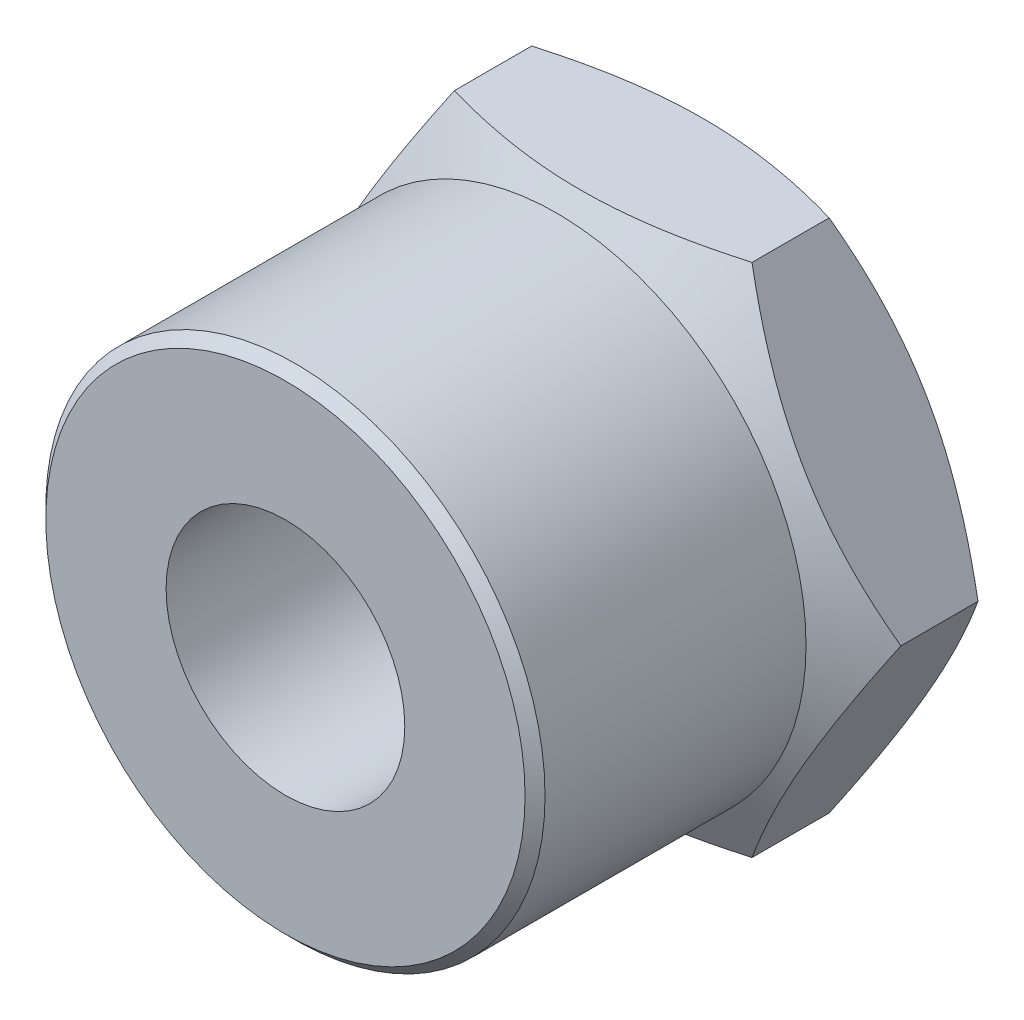
ISO-10303-21;
HEADER;
FILE_DESCRIPTION(('STEP AP214'),'2;1');
FILE_NAME('part.step','',(''),(''),'','','');
FILE_SCHEMA(('AUTOMOTIVE_DESIGN { 1 0 10303 214 1 1 1 1 }'));
ENDSEC;
DATA;
#1=APPLICATION_CONTEXT('core data for automotive mechanical design processes');
#2=APPLICATION_PROTOCOL_DEFINITION('international standard','automotive_design',2000,#1);
#3=PRODUCT_CONTEXT('',#1,'mechanical');
#4=PRODUCT('Part','Part','',(#3));
#5=PRODUCT_RELATED_PRODUCT_CATEGORY('part','',(#4));
#6=PRODUCT_DEFINITION_FORMATION('','',#4);
#7=PRODUCT_DEFINITION_CONTEXT('part definition',#1,'design');
#8=PRODUCT_DEFINITION('design','',#6,#7);
#9=PRODUCT_DEFINITION_SHAPE('','',#8);
#10=(LENGTH_UNIT() NAMED_UNIT(*) SI_UNIT(.MILLI.,.METRE.));
#11=(NAMED_UNIT(*) PLANE_ANGLE_UNIT() SI_UNIT($,.RADIAN.));
#12=(NAMED_UNIT(*) SI_UNIT($,.STERADIAN.) SOLID_ANGLE_UNIT());
#13=UNCERTAINTY_MEASURE_WITH_UNIT(LENGTH_MEASURE(1.E-05),#10,'distance_accuracy_value','');
#14=(GEOMETRIC_REPRESENTATION_CONTEXT(3) GLOBAL_UNCERTAINTY_ASSIGNED_CONTEXT((#13)) GLOBAL_UNIT_ASSIGNED_CONTEXT((#10,
#11,#12)) REPRESENTATION_CONTEXT('',''));
#15=CARTESIAN_POINT('',(0.,0.,0.));
#16=DIRECTION('',(0.,0.,1.));
#17=DIRECTION('',(1.,0.,0.));
#18=AXIS2_PLACEMENT_3D('',#15,#16,#17);
#19=CARTESIAN_POINT('',(2.02072594216369,-3.5,-2.32));
#20=DIRECTION('',(0.,0.,1.));
#21=DIRECTION('',(1.,0.,0.));
#22=AXIS2_PLACEMENT_3D('',#19,#20,#21);
#23=PLANE('',#22);
#24=CARTESIAN_POINT('',(0.,0.,-2.32));
#25=DIRECTION('',(0.,0.,-1.));
#26=DIRECTION('',(-1.,0.,0.));
#27=AXIS2_PLACEMENT_3D('',#24,#25,#26);
#28=CIRCLE('',#27,2.94);
#29=CARTESIAN_POINT('',(-2.94,0.,-2.32));
#30=VERTEX_POINT('',#29);
#31=EDGE_CURVE('E263',#30,#30,#28,.T.);
#32=ORIENTED_EDGE('',*,*,#31,.T.);
#33=EDGE_LOOP('',(#32));
#34=FACE_BOUND('',#33,.T.);
#35=CARTESIAN_POINT('',(0.,0.,-2.32));
#36=DIRECTION('',(0.,0.,-1.));
#37=DIRECTION('',(-1.,0.,0.));
#38=AXIS2_PLACEMENT_3D('',#35,#36,#37);
#39=CIRCLE('',#38,2.3);
#40=CARTESIAN_POINT('',(-2.3,0.,-2.32));
#41=VERTEX_POINT('',#40);
#42=EDGE_CURVE('E276',#41,#41,#39,.T.);
#43=ORIENTED_EDGE('',*,*,#42,.F.);
#44=EDGE_LOOP('',(#43));
#45=FACE_BOUND('',#44,.T.);
#46=ADVANCED_FACE('F40',(#34,#45),#23,.F.);
#47=CARTESIAN_POINT('',(0.,0.,-2.32));
#48=DIRECTION('',(0.,0.,1.));
#49=DIRECTION('',(1.,0.,0.));
#50=AXIS2_PLACEMENT_3D('',#47,#48,#49);
#51=CYLINDRICAL_SURFACE('',#50,1.621);
#52=CARTESIAN_POINT('',(0.,0.,3.68));
#53=DIRECTION('',(0.,0.,1.));
#54=DIRECTION('',(1.,0.,0.));
#55=AXIS2_PLACEMENT_3D('',#52,#53,#54);
#56=CIRCLE('',#55,1.621);
#57=CARTESIAN_POINT('',(1.621,0.,3.68));
#58=VERTEX_POINT('',#57);
#59=EDGE_CURVE('E272',#58,#58,#56,.T.);
#60=ORIENTED_EDGE('',*,*,#59,.T.);
#61=EDGE_LOOP('',(#60));
#62=FACE_BOUND('',#61,.T.);
#63=CARTESIAN_POINT('',(0.,0.,-1.64100000000001));
#64=DIRECTION('',(0.,0.,-1.));
#65=DIRECTION('',(-1.,0.,0.));
#66=AXIS2_PLACEMENT_3D('',#63,#64,#65);
#67=CIRCLE('',#66,1.621);
#68=CARTESIAN_POINT('',(-1.621,0.,-1.64100000000001));
#69=VERTEX_POINT('',#68);
#70=EDGE_CURVE('E280',#69,#69,#67,.T.);
#71=ORIENTED_EDGE('',*,*,#70,.T.);
#72=EDGE_LOOP('',(#71));
#73=FACE_BOUND('',#72,.T.);
#74=ADVANCED_FACE('F145',(#62,#73),#51,.F.);
#75=CARTESIAN_POINT('',(-2.02072594216369,-3.5,-2.32));
#76=DIRECTION('',(0.,-1.,0.));
#77=DIRECTION('',(1.,0.,0.));
#78=AXIS2_PLACEMENT_3D('',#75,#76,#77);
#79=PLANE('',#78);
#80=DIRECTION('',(0.,0.,1.));
#81=VECTOR('',#80,1.);
#82=CARTESIAN_POINT('',(2.02072594216369,-3.5,-2.32));
#83=LINE('',#82,#81);
#84=CARTESIAN_POINT('',(2.02072594216369,-3.5,-1.68407645808418));
#85=VERTEX_POINT('',#84);
#86=CARTESIAN_POINT('',(2.02072594216369,-3.5,-0.635923541915821));
#87=VERTEX_POINT('',#86);
#88=EDGE_CURVE('E126',#85,#87,#83,.T.);
#89=ORIENTED_EDGE('',*,*,#88,.T.);
#90=CARTESIAN_POINT('',(-5.31454874845532,-3.5,-1.9765720811429));
#91=CARTESIAN_POINT('',(-5.16258122990756,-3.5,-1.90331759820139));
#92=CARTESIAN_POINT('',(-5.01025238241219,-3.5,-1.83079919452992));
#93=CARTESIAN_POINT('',(-4.70467938387715,-3.5,-1.68765105137344));
#94=CARTESIAN_POINT('',(-4.55143508199682,-3.5,-1.61702163426252));
#95=CARTESIAN_POINT('',(-4.24299316158612,-3.5,-1.47768799287055));
#96=CARTESIAN_POINT('',(-4.08778936349747,-3.5,-1.40899739849654));
#97=CARTESIAN_POINT('',(-3.77610673866024,-3.5,-1.27458362807589));
#98=CARTESIAN_POINT('',(-3.61962797622453,-3.5,-1.20886030343221));
#99=CARTESIAN_POINT('',(-3.3005804505127,-3.5,-1.07931444616043));
#100=CARTESIAN_POINT('',(-3.13796663574968,-3.5,-1.01560223304694));
#101=CARTESIAN_POINT('',(-2.81079517715601,-3.5,-0.893280259239621));
#102=CARTESIAN_POINT('',(-2.64623731184219,-3.5,-0.834671086421076));
#103=CARTESIAN_POINT('',(-2.31526247835521,-3.5,-0.724177334443883));
#104=CARTESIAN_POINT('',(-2.14885045472674,-3.5,-0.672278099740526));
#105=CARTESIAN_POINT('',(-1.81364346014062,-3.5,-0.576943589600243));
#106=CARTESIAN_POINT('',(-1.64484929409527,-3.5,-0.533505525297072));
#107=CARTESIAN_POINT('',(-1.30568260005149,-3.5,-0.45747156967565));
#108=CARTESIAN_POINT('',(-1.13532228771221,-3.5,-0.424822222659642));
#109=CARTESIAN_POINT('',(-0.792607865436793,-3.5,-0.372291505668301));
#110=CARTESIAN_POINT('',(-0.620253909975512,-3.5,-0.352409153116377));
#111=CARTESIAN_POINT('',(-0.276613915604334,-3.5,-0.327259641551));
#112=CARTESIAN_POINT('',(-0.105341294584288,-3.5,-0.321813613265414));
#113=CARTESIAN_POINT('',(0.237055776931101,-3.5,-0.325534073470602));
#114=CARTESIAN_POINT('',(0.408180221365878,-3.5,-0.334701133794465));
#115=CARTESIAN_POINT('',(0.702169689121267,-3.5,-0.36237316965813));
#116=CARTESIAN_POINT('',(0.825358031993441,-3.5,-0.377614848627587));
#117=CARTESIAN_POINT('',(1.07075148822538,-3.5,-0.414658088633187));
#118=CARTESIAN_POINT('',(1.19295645014118,-3.5,-0.43646064093995));
#119=CARTESIAN_POINT('',(1.55797864523314,-3.5,-0.510554721049551));
#120=CARTESIAN_POINT('',(1.79905117963938,-3.5,-0.571516553748571));
#121=CARTESIAN_POINT('',(2.15941640181095,-3.5,-0.676194944406321));
#122=CARTESIAN_POINT('',(2.28060052215148,-3.5,-0.713762203690888));
#123=CARTESIAN_POINT('',(2.52179042226329,-3.5,-0.792539132299104));
#124=CARTESIAN_POINT('',(2.64179619441257,-3.5,-0.833748825166124));
#125=CARTESIAN_POINT('',(2.88067287145959,-3.5,-0.919171049808449));
#126=CARTESIAN_POINT('',(2.9995441911813,-3.5,-0.963382431928097));
#127=CARTESIAN_POINT('',(3.23631937174955,-3.5,-1.0543141707443));
#128=CARTESIAN_POINT('',(3.35422324182582,-3.5,-1.10103450347266));
#129=CARTESIAN_POINT('',(3.62325055264463,-3.5,-1.21041576615162));
#130=CARTESIAN_POINT('',(3.77409149467181,-3.5,-1.27377014376321));
#131=CARTESIAN_POINT('',(4.07458232381806,-3.5,-1.40324911382263));
#132=CARTESIAN_POINT('',(4.22423215400073,-3.5,-1.46937383776075));
#133=CARTESIAN_POINT('',(4.67173417074864,-3.5,-1.67107785140336));
#134=CARTESIAN_POINT('',(4.96809261237308,-3.5,-1.80996775263601));
#135=CARTESIAN_POINT('',(5.55823741540797,-3.5,-2.09369707696542));
#136=CARTESIAN_POINT('',(5.85202130868344,-3.5,-2.23854158231514));
#137=CARTESIAN_POINT('',(6.43755760037217,-3.5,-2.53229352913512));
#138=CARTESIAN_POINT('',(6.72930993368927,-3.5,-2.68120110005087));
#139=CARTESIAN_POINT('',(7.28854142597025,-3.5,-2.97015797177944));
#140=CARTESIAN_POINT('',(7.55613381304253,-3.5,-3.10998884424144));
#141=CARTESIAN_POINT('',(8.09034031227495,-3.5,-3.39152342794629));
#142=CARTESIAN_POINT('',(8.35695439615905,-3.5,-3.53322719278529));
#143=CARTESIAN_POINT('',(8.88884338623101,-3.5,-3.81776700197264));
#144=CARTESIAN_POINT('',(9.15411993703118,-3.5,-3.9605999764179));
#145=CARTESIAN_POINT('',(9.68404251934625,-3.5,-4.24740142981055));
#146=CARTESIAN_POINT('',(9.94868858014317,-3.5,-4.39136985463041));
#147=CARTESIAN_POINT('',(10.2130999375188,-3.5,-4.53576517093096));
#148=B_SPLINE_CURVE_WITH_KNOTS('',3,(#90,#91,#92,#93,#94,#95,#96,#97,#98,#99,#100,#101,#102,
#103,#104,#105,#106,#107,#108,#109,#110,#111,#112,#113,#114,#115,#116,#117,#118,#119,#120,#121,
#122,#123,#124,#125,#126,#127,#128,#129,#130,#131,#132,#133,#134,#135,#136,#137,#138,#139,#140,
#141,#142,#143,#144,#145,#146,#147),.UNSPECIFIED.,.F.,.F.,(4,2,2,2,2,2,2,2,2,2,2,2,2,2,2,2,2,2,
2,2,2,2,2,2,2,2,2,2,4),(0.,0.506112602260914,1.01231103347324,1.52146159900116,2.03058663857857,
2.55446946144371,3.07841255649538,3.60119121754863,4.12379727410696,4.64377368851295,
5.16371007956734,5.67717355982242,6.19065713320245,6.56285735176149,6.93511383364488,
7.68008332937184,8.06067514319643,8.44126941720855,8.82171873597982,9.20216442093658,
9.69294431735731,10.1837475343527,11.165504223446,12.1481169836564,13.1307610856319,
14.0365256940763,14.9423162789471,15.8461695773097,16.7499800458511),.UNSPECIFIED.);
#149=CARTESIAN_POINT('',(-2.02072594216369,-3.5,-0.635923541915821));
#150=VERTEX_POINT('',#149);
#151=EDGE_CURVE('E55',#87,#150,#148,.F.);
#152=ORIENTED_EDGE('',*,*,#151,.T.);
#153=DIRECTION('',(0.,0.,1.));
#154=VECTOR('',#153,1.);
#155=CARTESIAN_POINT('',(-2.02072594216369,-3.5,-2.32));
#156=LINE('',#155,#154);
#157=CARTESIAN_POINT('',(-2.02072594216369,-3.5,-1.68407645808418));
#158=VERTEX_POINT('',#157);
#159=EDGE_CURVE('E109',#158,#150,#156,.T.);
#160=ORIENTED_EDGE('',*,*,#159,.F.);
#161=CARTESIAN_POINT('',(-5.31454874845532,-3.5,-0.343427918857098));
#162=CARTESIAN_POINT('',(-5.16258122990756,-3.5,-0.416682401798613));
#163=CARTESIAN_POINT('',(-5.01025238241219,-3.5,-0.489200805470075));
#164=CARTESIAN_POINT('',(-4.70467938387715,-3.5,-0.632348948626556));
#165=CARTESIAN_POINT('',(-4.55143508199682,-3.5,-0.70297836573748));
#166=CARTESIAN_POINT('',(-4.24299316158612,-3.5,-0.842312007129446));
#167=CARTESIAN_POINT('',(-4.08778936349747,-3.5,-0.911002601503458));
#168=CARTESIAN_POINT('',(-3.77610673866024,-3.5,-1.04541637192411));
#169=CARTESIAN_POINT('',(-3.61962797622453,-3.5,-1.11113969656779));
#170=CARTESIAN_POINT('',(-3.3005804505127,-3.5,-1.24068555383956));
#171=CARTESIAN_POINT('',(-3.13796663574968,-3.5,-1.30439776695306));
#172=CARTESIAN_POINT('',(-2.81079517715601,-3.5,-1.42671974076038));
#173=CARTESIAN_POINT('',(-2.64623731184219,-3.5,-1.48532891357892));
#174=CARTESIAN_POINT('',(-2.31526247835521,-3.5,-1.59582266555612));
#175=CARTESIAN_POINT('',(-2.14885045472674,-3.5,-1.64772190025947));
#176=CARTESIAN_POINT('',(-1.81364346014062,-3.5,-1.74305641039976));
#177=CARTESIAN_POINT('',(-1.64484929409527,-3.5,-1.78649447470293));
#178=CARTESIAN_POINT('',(-1.30568260005149,-3.5,-1.86252843032435));
#179=CARTESIAN_POINT('',(-1.13532228771221,-3.5,-1.89517777734036));
#180=CARTESIAN_POINT('',(-0.792607865436793,-3.5,-1.9477084943317));
#181=CARTESIAN_POINT('',(-0.620253909975512,-3.5,-1.96759084688362));
#182=CARTESIAN_POINT('',(-0.276613915604334,-3.5,-1.992740358449));
#183=CARTESIAN_POINT('',(-0.105341294584288,-3.5,-1.99818638673459));
#184=CARTESIAN_POINT('',(0.237055776931101,-3.5,-1.9944659265294));
#185=CARTESIAN_POINT('',(0.408180221365878,-3.5,-1.98529886620553));
#186=CARTESIAN_POINT('',(0.702169689121266,-3.5,-1.95762683034187));
#187=CARTESIAN_POINT('',(0.82535803199344,-3.5,-1.94238515137241));
#188=CARTESIAN_POINT('',(1.07075148822538,-3.5,-1.90534191136681));
#189=CARTESIAN_POINT('',(1.19295645014118,-3.5,-1.88353935906005));
#190=CARTESIAN_POINT('',(1.55797864523314,-3.5,-1.80944527895045));
#191=CARTESIAN_POINT('',(1.79905117963938,-3.5,-1.74848344625143));
#192=CARTESIAN_POINT('',(2.15941640181095,-3.5,-1.64380505559368));
#193=CARTESIAN_POINT('',(2.28060052215148,-3.5,-1.60623779630911));
#194=CARTESIAN_POINT('',(2.52179042226329,-3.5,-1.5274608677009));
#195=CARTESIAN_POINT('',(2.64179619441257,-3.5,-1.48625117483388));
#196=CARTESIAN_POINT('',(2.88067287145959,-3.5,-1.40082895019155));
#197=CARTESIAN_POINT('',(2.9995441911813,-3.5,-1.3566175680719));
#198=CARTESIAN_POINT('',(3.23631937174955,-3.5,-1.2656858292557));
#199=CARTESIAN_POINT('',(3.35422324182582,-3.5,-1.21896549652734));
#200=CARTESIAN_POINT('',(3.62325055264463,-3.5,-1.10958423384838));
#201=CARTESIAN_POINT('',(3.77409149467181,-3.5,-1.04622985623679));
#202=CARTESIAN_POINT('',(4.07458232381806,-3.5,-0.916750886177373));
#203=CARTESIAN_POINT('',(4.22423215400073,-3.5,-0.850626162239254));
#204=CARTESIAN_POINT('',(4.67173417074864,-3.5,-0.648922148596642));
#205=CARTESIAN_POINT('',(4.96809261237308,-3.5,-0.510032247363986));
#206=CARTESIAN_POINT('',(5.55823741540797,-3.5,-0.226302923034582));
#207=CARTESIAN_POINT('',(5.85202130868344,-3.5,-0.081458417684857));
#208=CARTESIAN_POINT('',(6.43755760037218,-3.5,0.212293529135127));
#209=CARTESIAN_POINT('',(6.72930993368927,-3.5,0.361201100050876));
#210=CARTESIAN_POINT('',(7.28854142597026,-3.5,0.650157971779439));
#211=CARTESIAN_POINT('',(7.55613381304253,-3.5,0.789988844241439));
#212=CARTESIAN_POINT('',(8.09034031227495,-3.5,1.07152342794629));
#213=CARTESIAN_POINT('',(8.35695439615905,-3.5,1.21322719278529));
#214=CARTESIAN_POINT('',(8.88884338623101,-3.5,1.49776700197264));
#215=CARTESIAN_POINT('',(9.15411993703118,-3.5,1.6405999764179));
#216=CARTESIAN_POINT('',(9.68404251934625,-3.5,1.92740142981055));
#217=CARTESIAN_POINT('',(9.94868858014317,-3.5,2.07136985463041));
#218=CARTESIAN_POINT('',(10.2130999375188,-3.5,2.21576517093097));
#219=B_SPLINE_CURVE_WITH_KNOTS('',3,(#161,#162,#163,#164,#165,#166,#167,#168,#169,#170,#171,
#172,#173,#174,#175,#176,#177,#178,#179,#180,#181,#182,#183,#184,#185,#186,#187,#188,#189,#190,
#191,#192,#193,#194,#195,#196,#197,#198,#199,#200,#201,#202,#203,#204,#205,#206,#207,#208,#209,
#210,#211,#212,#213,#214,#215,#216,#217,#218),.UNSPECIFIED.,.F.,.F.,(4,2,2,2,2,2,2,2,2,2,2,2,2,
2,2,2,2,2,2,2,2,2,2,2,2,2,2,2,4),(0.,0.506112602260913,1.01231103347324,1.52146159900116,
2.03058663857857,2.55446946144371,3.07841255649537,3.60119121754863,4.12379727410696,
4.64377368851295,5.16371007956734,5.67717355982242,6.19065713320245,6.56285735176149,
6.93511383364488,7.68008332937184,8.06067514319643,8.44126941720855,8.82171873597982,
9.20216442093658,9.69294431735731,10.1837475343527,11.165504223446,12.1481169836564,
13.1307610856319,14.0365256940763,14.9423162789471,15.8461695773097,16.7499800458511),.UNSPECIFIED.);
#220=EDGE_CURVE('E128',#158,#85,#219,.T.);
#221=ORIENTED_EDGE('',*,*,#220,.T.);
#222=EDGE_LOOP('',(#89,#152,#160,#221));
#223=FACE_BOUND('',#222,.T.);
#224=ADVANCED_FACE('F151',(#223),#79,.T.);
#225=CARTESIAN_POINT('',(-4.04145188432738,0.,-2.32));
#226=DIRECTION('',(-0.866025403784438,-0.5,0.));
#227=DIRECTION('',(0.5,-0.866025403784439,0.));
#228=AXIS2_PLACEMENT_3D('',#225,#226,#227);
#229=PLANE('',#228);
#230=ORIENTED_EDGE('',*,*,#159,.T.);
#231=CARTESIAN_POINT('',(-2.02061047210985,-3.5002,-0.635990211439551));
#232=CARTESIAN_POINT('',(-2.10941108799267,-3.34639282154755,-0.584701939736164));
#233=CARTESIAN_POINT('',(-2.19897822522909,-3.19125798916558,-0.538057104562379));
#234=CARTESIAN_POINT('',(-2.37966345361545,-2.87830199342322,-0.456638026279531));
#235=CARTESIAN_POINT('',(-2.47078475532382,-2.7204752692125,-0.421892586330745));
#236=CARTESIAN_POINT('',(-2.65189807961074,-2.40677778961987,-0.36780617792902));
#237=CARTESIAN_POINT('',(-2.74186223545399,-2.25095530083931,-0.348105237006566));
#238=CARTESIAN_POINT('',(-2.92221386641056,-1.93857711279463,-0.324586283483439));
#239=CARTESIAN_POINT('',(-3.01260068598001,-1.78202254896577,-0.32074879529175));
#240=CARTESIAN_POINT('',(-3.1814939814933,-1.48949078007901,-0.328731452623163));
#241=CARTESIAN_POINT('',(-3.26002573814993,-1.3534697875421,-0.338591584815792));
#242=CARTESIAN_POINT('',(-3.41657761679354,-1.08231397971101,-0.369842617645588));
#243=CARTESIAN_POINT('',(-3.49459719728458,-0.947180102315318,-0.391244194031982));
#244=CARTESIAN_POINT('',(-3.65147186489429,-0.675465207594817,-0.444746558626761));
#245=CARTESIAN_POINT('',(-3.73030709667644,-0.538918580721665,-0.47707414519127));
#246=CARTESIAN_POINT('',(-3.88680174018324,-0.267861907055498,-0.550445084554177));
#247=CARTESIAN_POINT('',(-3.96446315689009,-0.133348387531463,-0.591471197316049));
#248=CARTESIAN_POINT('',(-4.04156735438122,0.000200000000000535,-0.635990211439552));
#249=B_SPLINE_CURVE_WITH_KNOTS('',3,(#231,#232,#233,#234,#235,#236,#237,#238,#239,#240,#241,
#242,#243,#244,#245,#246,#247,#248),.UNSPECIFIED.,.F.,.F.,(4,2,2,2,2,2,2,2,4),(0.,
0.554793832886252,1.11092123814983,1.65328467083218,2.19498204478403,2.6666513085086,
3.13875761298267,3.62133612600509,4.10296698719187),.UNSPECIFIED.);
#250=CARTESIAN_POINT('',(-4.04145188432738,0.,-0.635923541915821));
#251=VERTEX_POINT('',#250);
#252=EDGE_CURVE('E94',#150,#251,#249,.T.);
#253=ORIENTED_EDGE('',*,*,#252,.T.);
#254=DIRECTION('',(0.,0.,1.));
#255=VECTOR('',#254,1.);
#256=CARTESIAN_POINT('',(-4.04145188432738,0.,-2.32));
#257=LINE('',#256,#255);
#258=CARTESIAN_POINT('',(-4.04145188432738,0.,-1.68407645808418));
#259=VERTEX_POINT('',#258);
#260=EDGE_CURVE('E107',#259,#251,#257,.T.);
#261=ORIENTED_EDGE('',*,*,#260,.F.);
#262=CARTESIAN_POINT('',(-4.04156735438122,0.000200000000000461,-1.68400978856045));
#263=CARTESIAN_POINT('',(-3.9527667384984,-0.153607178452449,-1.73529806026383));
#264=CARTESIAN_POINT('',(-3.86319960126198,-0.308742010834423,-1.78194289543762));
#265=CARTESIAN_POINT('',(-3.68251437287563,-0.62169800657678,-1.86336197372047));
#266=CARTESIAN_POINT('',(-3.59139307116725,-0.779524730787495,-1.89810741366925));
#267=CARTESIAN_POINT('',(-3.41027974688034,-1.09322221038013,-1.95219382207098));
#268=CARTESIAN_POINT('',(-3.32031559103708,-1.24904469916069,-1.97189476299343));
#269=CARTESIAN_POINT('',(-3.13996396008052,-1.56142288720537,-1.99541371651656));
#270=CARTESIAN_POINT('',(-3.04957714051106,-1.71797745103423,-1.99925120470825));
#271=CARTESIAN_POINT('',(-2.88068384499778,-2.01050921992099,-1.99126854737684));
#272=CARTESIAN_POINT('',(-2.80215208834115,-2.1465302124579,-1.98140841518421));
#273=CARTESIAN_POINT('',(-2.64560020969754,-2.41768602028899,-1.95015738235441));
#274=CARTESIAN_POINT('',(-2.5675806292065,-2.55281989768468,-1.92875580596802));
#275=CARTESIAN_POINT('',(-2.41070596159679,-2.82453479240518,-1.87525344137324));
#276=CARTESIAN_POINT('',(-2.33187072981464,-2.96108141927833,-1.84292585480873));
#277=CARTESIAN_POINT('',(-2.17537608630783,-3.2321380929445,-1.76955491544582));
#278=CARTESIAN_POINT('',(-2.09771466960099,-3.36665161246854,-1.72852880268395));
#279=CARTESIAN_POINT('',(-2.02061047210985,-3.5002,-1.68400978856045));
#280=B_SPLINE_CURVE_WITH_KNOTS('',3,(#262,#263,#264,#265,#266,#267,#268,#269,#270,#271,#272,
#273,#274,#275,#276,#277,#278,#279),.UNSPECIFIED.,.F.,.F.,(4,2,2,2,2,2,2,2,4),(0.,
0.554793832886253,1.11092123814983,1.65328467083218,2.19498204478403,2.6666513085086,
3.13875761298267,3.62133612600509,4.10296698719187),.UNSPECIFIED.);
#281=EDGE_CURVE('E165',#259,#158,#280,.T.);
#282=ORIENTED_EDGE('',*,*,#281,.T.);
#283=EDGE_LOOP('',(#230,#253,#261,#282));
#284=FACE_BOUND('',#283,.T.);
#285=ADVANCED_FACE('F105',(#284),#229,.T.);
#286=CARTESIAN_POINT('',(-2.02072594216369,3.5,-2.32));
#287=DIRECTION('',(-0.866025403784439,0.5,0.));
#288=DIRECTION('',(-0.5,-0.866025403784439,0.));
#289=AXIS2_PLACEMENT_3D('',#286,#287,#288);
#290=PLANE('',#289);
#291=ORIENTED_EDGE('',*,*,#260,.T.);
#292=CARTESIAN_POINT('',(-4.04156735438122,-0.000199999999999577,-0.635990211439552));
#293=CARTESIAN_POINT('',(-3.9527667384984,0.15360717845245,-0.584701939736165));
#294=CARTESIAN_POINT('',(-3.86319960126198,0.308742010834424,-0.538057104562379));
#295=CARTESIAN_POINT('',(-3.68251437287562,0.621698006576781,-0.456638026279532));
#296=CARTESIAN_POINT('',(-3.59139307116725,0.779524730787495,-0.421892586330746));
#297=CARTESIAN_POINT('',(-3.41027974688034,1.09322221038013,-0.367806177929021));
#298=CARTESIAN_POINT('',(-3.32031559103708,1.24904469916069,-0.348105237006567));
#299=CARTESIAN_POINT('',(-3.13996396008052,1.56142288720537,-0.32458628348344));
#300=CARTESIAN_POINT('',(-3.04957714051106,1.71797745103423,-0.320748795291751));
#301=CARTESIAN_POINT('',(-2.88068384499778,2.01050921992099,-0.328731452623163));
#302=CARTESIAN_POINT('',(-2.80215208834115,2.1465302124579,-0.338591584815792));
#303=CARTESIAN_POINT('',(-2.64560020969754,2.41768602028899,-0.369842617645588));
#304=CARTESIAN_POINT('',(-2.5675806292065,2.55281989768468,-0.391244194031982));
#305=CARTESIAN_POINT('',(-2.41070596159679,2.82453479240518,-0.44474655862676));
#306=CARTESIAN_POINT('',(-2.33187072981464,2.96108141927834,-0.477074145191269));
#307=CARTESIAN_POINT('',(-2.17537608630783,3.2321380929445,-0.550445084554175));
#308=CARTESIAN_POINT('',(-2.09771466960099,3.36665161246854,-0.591471197316047));
#309=CARTESIAN_POINT('',(-2.02061047210985,3.5002,-0.635990211439551));
#310=B_SPLINE_CURVE_WITH_KNOTS('',3,(#292,#293,#294,#295,#296,#297,#298,#299,#300,#301,#302,
#303,#304,#305,#306,#307,#308,#309),.UNSPECIFIED.,.F.,.F.,(4,2,2,2,2,2,2,2,4),(0.,
0.554793832886253,1.11092123814983,1.65328467083218,2.19498204478403,2.6666513085086,
3.13875761298267,3.62133612600509,4.10296698719187),.UNSPECIFIED.);
#311=CARTESIAN_POINT('',(-2.02072594216369,3.5,-0.635923541915821));
#312=VERTEX_POINT('',#311);
#313=EDGE_CURVE('E91',#251,#312,#310,.T.);
#314=ORIENTED_EDGE('',*,*,#313,.T.);
#315=DIRECTION('',(0.,0.,1.));
#316=VECTOR('',#315,1.);
#317=CARTESIAN_POINT('',(-2.02072594216369,3.5,-2.32));
#318=LINE('',#317,#316);
#319=CARTESIAN_POINT('',(-2.02072594216368,3.5,-1.68407645808418));
#320=VERTEX_POINT('',#319);
#321=EDGE_CURVE('E114',#320,#312,#318,.T.);
#322=ORIENTED_EDGE('',*,*,#321,.F.);
#323=CARTESIAN_POINT('',(-2.02061047210985,3.5002,-1.68400978856045));
#324=CARTESIAN_POINT('',(-2.10941108799267,3.34639282154755,-1.73529806026383));
#325=CARTESIAN_POINT('',(-2.19897822522909,3.19125798916558,-1.78194289543762));
#326=CARTESIAN_POINT('',(-2.37966345361545,2.87830199342322,-1.86336197372047));
#327=CARTESIAN_POINT('',(-2.47078475532382,2.72047526921251,-1.89810741366925));
#328=CARTESIAN_POINT('',(-2.65189807961074,2.40677778961987,-1.95219382207098));
#329=CARTESIAN_POINT('',(-2.74186223545399,2.25095530083931,-1.97189476299343));
#330=CARTESIAN_POINT('',(-2.92221386641056,1.93857711279463,-1.99541371651656));
#331=CARTESIAN_POINT('',(-3.01260068598001,1.78202254896577,-1.99925120470825));
#332=CARTESIAN_POINT('',(-3.1814939814933,1.48949078007901,-1.99126854737684));
#333=CARTESIAN_POINT('',(-3.26002573814993,1.3534697875421,-1.98140841518421));
#334=CARTESIAN_POINT('',(-3.41657761679354,1.08231397971101,-1.95015738235441));
#335=CARTESIAN_POINT('',(-3.49459719728458,0.947180102315319,-1.92875580596802));
#336=CARTESIAN_POINT('',(-3.65147186489429,0.675465207594818,-1.87525344137324));
#337=CARTESIAN_POINT('',(-3.73030709667644,0.538918580721666,-1.84292585480873));
#338=CARTESIAN_POINT('',(-3.88680174018324,0.267861907055499,-1.76955491544582));
#339=CARTESIAN_POINT('',(-3.96446315689009,0.133348387531464,-1.72852880268395));
#340=CARTESIAN_POINT('',(-4.04156735438122,-0.00019999999999979,-1.68400978856045));
#341=B_SPLINE_CURVE_WITH_KNOTS('',3,(#323,#324,#325,#326,#327,#328,#329,#330,#331,#332,#333,
#334,#335,#336,#337,#338,#339,#340),.UNSPECIFIED.,.F.,.F.,(4,2,2,2,2,2,2,2,4),(0.,
0.554793832886252,1.11092123814983,1.65328467083218,2.19498204478403,2.6666513085086,
3.13875761298267,3.62133612600509,4.10296698719187),.UNSPECIFIED.);
#342=EDGE_CURVE('E113',#320,#259,#341,.T.);
#343=ORIENTED_EDGE('',*,*,#342,.T.);
#344=EDGE_LOOP('',(#291,#314,#322,#343));
#345=FACE_BOUND('',#344,.T.);
#346=ADVANCED_FACE('F112',(#345),#290,.T.);
#347=CARTESIAN_POINT('',(2.02072594216369,3.5,-2.32));
#348=DIRECTION('',(0.,1.,0.));
#349=DIRECTION('',(-1.,0.,0.));
#350=AXIS2_PLACEMENT_3D('',#347,#348,#349);
#351=PLANE('',#350);
#352=ORIENTED_EDGE('',*,*,#321,.T.);
#353=CARTESIAN_POINT('',(-5.31454874840541,3.5,-1.97657208111884));
#354=CARTESIAN_POINT('',(-5.16258122985933,3.5,-1.90331759817834));
#355=CARTESIAN_POINT('',(-5.01025238236563,3.5,-1.83079919450789));
#356=CARTESIAN_POINT('',(-4.70467938383394,3.5,-1.68765105135343));
#357=CARTESIAN_POINT('',(-4.55143508195529,3.5,-1.61702163424352));
#358=CARTESIAN_POINT('',(-4.24299316154799,3.5,-1.47768799285357));
#359=CARTESIAN_POINT('',(-4.08778936346104,3.5,-1.40899739848057));
#360=CARTESIAN_POINT('',(-3.77610673862723,3.5,-1.27458362806192));
#361=CARTESIAN_POINT('',(-3.61962797619325,3.5,-1.20886030341923));
#362=CARTESIAN_POINT('',(-3.30058045048498,3.5,-1.07931444614946));
#363=CARTESIAN_POINT('',(-3.13796663572379,3.5,-1.01560223303697));
#364=CARTESIAN_POINT('',(-2.81079517713381,3.5,-0.893280259231607));
#365=CARTESIAN_POINT('',(-2.64623731182185,3.5,-0.834671086414012));
#366=CARTESIAN_POINT('',(-2.31526247833863,3.5,-0.724177334438621));
#367=CARTESIAN_POINT('',(-2.14885045471206,3.5,-0.672278099736118));
#368=CARTESIAN_POINT('',(-1.81364346012979,3.5,-0.576943589597394));
#369=CARTESIAN_POINT('',(-1.64484929408638,3.5,-0.53350552529493));
#370=CARTESIAN_POINT('',(-1.30568260004756,3.5,-0.457471569674922));
#371=CARTESIAN_POINT('',(-1.13532228771131,3.5,-0.424822222659559));
#372=CARTESIAN_POINT('',(-0.792607865442006,3.5,-0.372291505669046));
#373=CARTESIAN_POINT('',(-0.620253909983814,3.5,-0.352409153117303));
#374=CARTESIAN_POINT('',(-0.27661391561876,3.5,-0.327259641551743));
#375=CARTESIAN_POINT('',(-0.105341294601749,3.5,-0.321813613265802));
#376=CARTESIAN_POINT('',(0.237055776907625,3.5,-0.32553407346977));
#377=CARTESIAN_POINT('',(0.408180221339422,3.5,-0.334701133792768));
#378=CARTESIAN_POINT('',(0.702169689090969,3.5,-0.362373169654703));
#379=CARTESIAN_POINT('',(0.825358031962249,3.5,-0.377614848623463));
#380=CARTESIAN_POINT('',(1.07075148819244,3.5,-0.414658088627631));
#381=CARTESIAN_POINT('',(1.19295645010738,3.5,-0.43646064093366));
#382=CARTESIAN_POINT('',(1.55797864519681,3.5,-0.510554721041038));
#383=CARTESIAN_POINT('',(1.79905117960143,3.5,-0.571516553738553));
#384=CARTESIAN_POINT('',(2.15941640177056,3.5,-0.676194944394077));
#385=CARTESIAN_POINT('',(2.28060052211027,3.5,-0.713762203677897));
#386=CARTESIAN_POINT('',(2.52179042222043,3.5,-0.792539132284638));
#387=CARTESIAN_POINT('',(2.64179619436889,3.5,-0.83374882515093));
#388=CARTESIAN_POINT('',(2.88067287141428,3.5,-0.919171049791824));
#389=CARTESIAN_POINT('',(2.99954419113518,3.5,-0.963382431910767));
#390=CARTESIAN_POINT('',(3.2363193717018,3.5,-1.05431417072558));
#391=CARTESIAN_POINT('',(3.35422324177726,3.5,-1.10103450345325));
#392=CARTESIAN_POINT('',(3.62325055259547,3.5,-1.21041576613119));
#393=CARTESIAN_POINT('',(3.77409149462286,3.5,-1.27377014374248));
#394=CARTESIAN_POINT('',(4.0745823237695,3.5,-1.40324911380135));
#395=CARTESIAN_POINT('',(4.22423215395235,3.5,-1.46937383773923));
#396=CARTESIAN_POINT('',(4.67173417070078,3.5,-1.67107785138121));
#397=CARTESIAN_POINT('',(4.96809261232553,3.5,-1.80996775261355));
#398=CARTESIAN_POINT('',(5.558237415361,3.5,-2.09369707694245));
#399=CARTESIAN_POINT('',(5.85202130863674,3.5,-2.23854158229198));
#400=CARTESIAN_POINT('',(6.43755760032597,3.5,-2.53229352911168));
#401=CARTESIAN_POINT('',(6.7293099336433,3.5,-2.68120110002732));
#402=CARTESIAN_POINT('',(7.28854142592454,3.5,-2.97015797175564));
#403=CARTESIAN_POINT('',(7.55613381299684,3.5,-3.1099888442175));
#404=CARTESIAN_POINT('',(8.09034031222931,3.5,-3.3915234279221));
#405=CARTESIAN_POINT('',(8.35695439611342,3.5,-3.53322719276098));
#406=CARTESIAN_POINT('',(8.88884338618538,3.5,-3.81776700194812));
#407=CARTESIAN_POINT('',(9.15411993698553,3.5,-3.96059997639328));
#408=CARTESIAN_POINT('',(9.68404251930055,3.5,-4.24740142978573));
#409=CARTESIAN_POINT('',(9.94868858009744,3.5,-4.3913698546055));
#410=CARTESIAN_POINT('',(10.213099937473,3.5,-4.53576517090597));
#411=B_SPLINE_CURVE_WITH_KNOTS('',3,(#353,#354,#355,#356,#357,#358,#359,#360,#361,#362,#363,
#364,#365,#366,#367,#368,#369,#370,#371,#372,#373,#374,#375,#376,#377,#378,#379,#380,#381,#382,
#383,#384,#385,#386,#387,#388,#389,#390,#391,#392,#393,#394,#395,#396,#397,#398,#399,#400,#401,
#402,#403,#404,#405,#406,#407,#408,#409,#410),.UNSPECIFIED.,.F.,.F.,(4,2,2,2,2,2,2,2,2,2,2,2,2,
2,2,2,2,2,2,2,2,2,2,2,2,2,2,2,4),(0.,0.506112602255072,1.01231103346155,1.52146159898356,
2.03058663855506,2.55446946141398,3.07841255645943,3.60119121750649,4.12379727405863,
4.64377368845537,5.16371007950052,5.67717355974656,6.19065713311756,6.56285735167369,
6.93511383355416,7.68008332927527,8.06067514309683,8.44126941710592,8.82171873587416,
9.2021644208279,9.69294431724884,10.1837475342444,11.1655042233382,12.148116983549,
13.130761085525,14.0365256939693,14.9423162788399,15.8461695772024,16.7499800457436),.UNSPECIFIED.);
#412=CARTESIAN_POINT('',(2.02072594216369,3.5,-0.635923541915821));
#413=VERTEX_POINT('',#412);
#414=EDGE_CURVE('E96',#312,#413,#411,.T.);
#415=ORIENTED_EDGE('',*,*,#414,.T.);
#416=DIRECTION('',(0.,0.,1.));
#417=VECTOR('',#416,1.);
#418=CARTESIAN_POINT('',(2.02072594216369,3.5,-2.32));
#419=LINE('',#418,#417);
#420=CARTESIAN_POINT('',(2.02072594216369,3.5,-1.68407645808418));
#421=VERTEX_POINT('',#420);
#422=EDGE_CURVE('E117',#421,#413,#419,.T.);
#423=ORIENTED_EDGE('',*,*,#422,.F.);
#424=CARTESIAN_POINT('',(-5.31454874840541,3.5,-0.343427918881162));
#425=CARTESIAN_POINT('',(-5.16258122985933,3.5,-0.416682401821662));
#426=CARTESIAN_POINT('',(-5.01025238236563,3.5,-0.48920080549211));
#427=CARTESIAN_POINT('',(-4.70467938383394,3.5,-0.632348948646569));
#428=CARTESIAN_POINT('',(-4.55143508195529,3.5,-0.702978365756483));
#429=CARTESIAN_POINT('',(-4.24299316154799,3.5,-0.84231200714643));
#430=CARTESIAN_POINT('',(-4.08778936346104,3.5,-0.911002601519431));
#431=CARTESIAN_POINT('',(-3.77610673862723,3.5,-1.04541637193808));
#432=CARTESIAN_POINT('',(-3.61962797619325,3.5,-1.11113969658077));
#433=CARTESIAN_POINT('',(-3.30058045048498,3.5,-1.24068555385054));
#434=CARTESIAN_POINT('',(-3.13796663572379,3.5,-1.30439776696303));
#435=CARTESIAN_POINT('',(-2.81079517713381,3.5,-1.42671974076839));
#436=CARTESIAN_POINT('',(-2.64623731182185,3.5,-1.48532891358599));
#437=CARTESIAN_POINT('',(-2.31526247833863,3.5,-1.59582266556138));
#438=CARTESIAN_POINT('',(-2.14885045471206,3.5,-1.64772190026388));
#439=CARTESIAN_POINT('',(-1.81364346012979,3.5,-1.7430564104026));
#440=CARTESIAN_POINT('',(-1.64484929408638,3.5,-1.78649447470507));
#441=CARTESIAN_POINT('',(-1.30568260004756,3.5,-1.86252843032508));
#442=CARTESIAN_POINT('',(-1.13532228771131,3.5,-1.89517777734044));
#443=CARTESIAN_POINT('',(-0.792607865442006,3.5,-1.94770849433095));
#444=CARTESIAN_POINT('',(-0.620253909983814,3.5,-1.9675908468827));
#445=CARTESIAN_POINT('',(-0.27661391561876,3.5,-1.99274035844826));
#446=CARTESIAN_POINT('',(-0.105341294601748,3.5,-1.9981863867342));
#447=CARTESIAN_POINT('',(0.237055776907626,3.5,-1.99446592653023));
#448=CARTESIAN_POINT('',(0.408180221339422,3.5,-1.98529886620723));
#449=CARTESIAN_POINT('',(0.702169689090969,3.5,-1.9576268303453));
#450=CARTESIAN_POINT('',(0.825358031962249,3.5,-1.94238515137654));
#451=CARTESIAN_POINT('',(1.07075148819244,3.5,-1.90534191137237));
#452=CARTESIAN_POINT('',(1.19295645010738,3.5,-1.88353935906634));
#453=CARTESIAN_POINT('',(1.55797864519681,3.5,-1.80944527895896));
#454=CARTESIAN_POINT('',(1.79905117960143,3.5,-1.74848344626145));
#455=CARTESIAN_POINT('',(2.15941640177056,3.5,-1.64380505560592));
#456=CARTESIAN_POINT('',(2.28060052211027,3.5,-1.6062377963221));
#457=CARTESIAN_POINT('',(2.52179042222043,3.5,-1.52746086771536));
#458=CARTESIAN_POINT('',(2.64179619436889,3.5,-1.48625117484907));
#459=CARTESIAN_POINT('',(2.88067287141429,3.5,-1.40082895020817));
#460=CARTESIAN_POINT('',(2.99954419113518,3.5,-1.35661756808923));
#461=CARTESIAN_POINT('',(3.23631937170181,3.5,-1.26568582927442));
#462=CARTESIAN_POINT('',(3.35422324177726,3.5,-1.21896549654674));
#463=CARTESIAN_POINT('',(3.62325055259547,3.5,-1.10958423386881));
#464=CARTESIAN_POINT('',(3.77409149462286,3.5,-1.04622985625752));
#465=CARTESIAN_POINT('',(4.0745823237695,3.5,-0.916750886198652));
#466=CARTESIAN_POINT('',(4.22423215395235,3.5,-0.85062616226077));
#467=CARTESIAN_POINT('',(4.67173417070078,3.5,-0.648922148618791));
#468=CARTESIAN_POINT('',(4.96809261232553,3.5,-0.510032247386452));
#469=CARTESIAN_POINT('',(5.55823741536101,3.5,-0.226302923057551));
#470=CARTESIAN_POINT('',(5.85202130863674,3.5,-0.0814584177080119));
#471=CARTESIAN_POINT('',(6.43755760032598,3.5,0.212293529111678));
#472=CARTESIAN_POINT('',(6.7293099336433,3.5,0.36120110002732));
#473=CARTESIAN_POINT('',(7.28854142592454,3.5,0.65015797175564));
#474=CARTESIAN_POINT('',(7.55613381299685,3.5,0.7899888442175));
#475=CARTESIAN_POINT('',(8.09034031222931,3.5,1.0715234279221));
#476=CARTESIAN_POINT('',(8.35695439611342,3.5,1.21322719276099));
#477=CARTESIAN_POINT('',(8.88884338618538,3.5,1.49776700194812));
#478=CARTESIAN_POINT('',(9.15411993698553,3.5,1.64059997639328));
#479=CARTESIAN_POINT('',(9.68404251930055,3.5,1.92740142978573));
#480=CARTESIAN_POINT('',(9.94868858009744,3.5,2.0713698546055));
#481=CARTESIAN_POINT('',(10.213099937473,3.5,2.21576517090597));
#482=B_SPLINE_CURVE_WITH_KNOTS('',3,(#424,#425,#426,#427,#428,#429,#430,#431,#432,#433,#434,
#435,#436,#437,#438,#439,#440,#441,#442,#443,#444,#445,#446,#447,#448,#449,#450,#451,#452,#453,
#454,#455,#456,#457,#458,#459,#460,#461,#462,#463,#464,#465,#466,#467,#468,#469,#470,#471,#472,
#473,#474,#475,#476,#477,#478,#479,#480,#481),.UNSPECIFIED.,.F.,.F.,(4,2,2,2,2,2,2,2,2,2,2,2,2,
2,2,2,2,2,2,2,2,2,2,2,2,2,2,2,4),(0.,0.506112602255071,1.01231103346155,1.52146159898356,
2.03058663855506,2.55446946141398,3.07841255645943,3.60119121750649,4.12379727405863,
4.64377368845537,5.16371007950052,5.67717355974656,6.19065713311756,6.56285735167369,
6.93511383355416,7.68008332927527,8.06067514309683,8.44126941710592,8.82171873587417,
9.2021644208279,9.69294431724884,10.1837475342444,11.1655042233382,12.148116983549,
13.130761085525,14.0365256939693,14.9423162788399,15.8461695772024,16.7499800457436),.UNSPECIFIED.);
#483=EDGE_CURVE('E227',#421,#320,#482,.F.);
#484=ORIENTED_EDGE('',*,*,#483,.T.);
#485=EDGE_LOOP('',(#352,#415,#423,#484));
#486=FACE_BOUND('',#485,.T.);
#487=ADVANCED_FACE('F219',(#486),#351,.T.);
#488=CARTESIAN_POINT('',(4.04145188432738,0.,-2.32));
#489=DIRECTION('',(0.866025403784438,0.5,0.));
#490=DIRECTION('',(-0.5,0.866025403784439,0.));
#491=AXIS2_PLACEMENT_3D('',#488,#489,#490);
#492=PLANE('',#491);
#493=ORIENTED_EDGE('',*,*,#422,.T.);
#494=CARTESIAN_POINT('',(2.02061047210985,3.5002,-0.63599021143955));
#495=CARTESIAN_POINT('',(2.10941108799267,3.34639282154755,-0.584701939736163));
#496=CARTESIAN_POINT('',(2.19897822522909,3.19125798916558,-0.538057104562377));
#497=CARTESIAN_POINT('',(2.37966345361545,2.87830199342322,-0.45663802627953));
#498=CARTESIAN_POINT('',(2.47078475532382,2.72047526921251,-0.421892586330743));
#499=CARTESIAN_POINT('',(2.65189807961073,2.40677778961988,-0.367806177929019));
#500=CARTESIAN_POINT('',(2.74186223545399,2.25095530083931,-0.348105237006564));
#501=CARTESIAN_POINT('',(2.92221386641055,1.93857711279463,-0.324586283483437));
#502=CARTESIAN_POINT('',(3.01260068598001,1.78202254896577,-0.320748795291748));
#503=CARTESIAN_POINT('',(3.18149398149329,1.48949078007902,-0.32873145262316));
#504=CARTESIAN_POINT('',(3.26002573814992,1.3534697875421,-0.33859158481579));
#505=CARTESIAN_POINT('',(3.41657761679353,1.08231397971101,-0.369842617645585));
#506=CARTESIAN_POINT('',(3.49459719728457,0.94718010231532,-0.39124419403198));
#507=CARTESIAN_POINT('',(3.65147186489428,0.675465207594819,-0.444746558626758));
#508=CARTESIAN_POINT('',(3.73030709667643,0.538918580721667,-0.477074145191267));
#509=CARTESIAN_POINT('',(3.88680174018324,0.267861907055501,-0.550445084554174));
#510=CARTESIAN_POINT('',(3.96446315689008,0.133348387531466,-0.591471197316046));
#511=CARTESIAN_POINT('',(4.04156735438122,-0.000199999999998464,-0.635990211439549));
#512=B_SPLINE_CURVE_WITH_KNOTS('',3,(#494,#495,#496,#497,#498,#499,#500,#501,#502,#503,#504,
#505,#506,#507,#508,#509,#510,#511),.UNSPECIFIED.,.F.,.F.,(4,2,2,2,2,2,2,2,4),(0.,
0.554793832886252,1.11092123814983,1.65328467083218,2.19498204478403,2.6666513085086,
3.13875761298267,3.62133612600509,4.10296698719187),.UNSPECIFIED.);
#513=CARTESIAN_POINT('',(4.04145188432738,0.,-0.635923541915821));
#514=VERTEX_POINT('',#513);
#515=EDGE_CURVE('E208',#413,#514,#512,.T.);
#516=ORIENTED_EDGE('',*,*,#515,.T.);
#517=DIRECTION('',(0.,0.,1.));
#518=VECTOR('',#517,1.);
#519=CARTESIAN_POINT('',(4.04145188432738,0.,-2.32));
#520=LINE('',#519,#518);
#521=CARTESIAN_POINT('',(4.04145188432738,0.,-1.68407645808418));
#522=VERTEX_POINT('',#521);
#523=EDGE_CURVE('E123',#522,#514,#520,.T.);
#524=ORIENTED_EDGE('',*,*,#523,.F.);
#525=CARTESIAN_POINT('',(4.04156735438122,-0.000199999999998299,-1.68400978856045));
#526=CARTESIAN_POINT('',(3.9527667384984,0.153607178452451,-1.73529806026384));
#527=CARTESIAN_POINT('',(3.86319960126198,0.308742010834425,-1.78194289543762));
#528=CARTESIAN_POINT('',(3.68251437287562,0.621698006576782,-1.86336197372047));
#529=CARTESIAN_POINT('',(3.59139307116725,0.779524730787496,-1.89810741366926));
#530=CARTESIAN_POINT('',(3.41027974688034,1.09322221038013,-1.95219382207098));
#531=CARTESIAN_POINT('',(3.32031559103708,1.24904469916069,-1.97189476299343));
#532=CARTESIAN_POINT('',(3.13996396008051,1.56142288720537,-1.99541371651656));
#533=CARTESIAN_POINT('',(3.04957714051106,1.71797745103423,-1.99925120470825));
#534=CARTESIAN_POINT('',(2.88068384499777,2.01050921992099,-1.99126854737684));
#535=CARTESIAN_POINT('',(2.80215208834114,2.1465302124579,-1.98140841518421));
#536=CARTESIAN_POINT('',(2.64560020969753,2.41768602028899,-1.95015738235441));
#537=CARTESIAN_POINT('',(2.56758062920649,2.55281989768468,-1.92875580596802));
#538=CARTESIAN_POINT('',(2.41070596159678,2.82453479240518,-1.87525344137324));
#539=CARTESIAN_POINT('',(2.33187072981463,2.96108141927834,-1.84292585480873));
#540=CARTESIAN_POINT('',(2.17537608630783,3.2321380929445,-1.76955491544583));
#541=CARTESIAN_POINT('',(2.09771466960098,3.36665161246854,-1.72852880268395));
#542=CARTESIAN_POINT('',(2.02061047210985,3.5002,-1.68400978856045));
#543=B_SPLINE_CURVE_WITH_KNOTS('',3,(#525,#526,#527,#528,#529,#530,#531,#532,#533,#534,#535,
#536,#537,#538,#539,#540,#541,#542),.UNSPECIFIED.,.F.,.F.,(4,2,2,2,2,2,2,2,4),(0.,
0.554793832886252,1.11092123814983,1.65328467083218,2.19498204478402,2.66665130850859,
3.13875761298267,3.62133612600509,4.10296698719187),.UNSPECIFIED.);
#544=EDGE_CURVE('E63',#522,#421,#543,.T.);
#545=ORIENTED_EDGE('',*,*,#544,.T.);
#546=EDGE_LOOP('',(#493,#516,#524,#545));
#547=FACE_BOUND('',#546,.T.);
#548=ADVANCED_FACE('F222',(#547),#492,.T.);
#549=CARTESIAN_POINT('',(2.02072594216369,-3.5,-2.32));
#550=DIRECTION('',(0.866025403784439,-0.5,0.));
#551=DIRECTION('',(0.5,0.866025403784439,0.));
#552=AXIS2_PLACEMENT_3D('',#549,#550,#551);
#553=PLANE('',#552);
#554=ORIENTED_EDGE('',*,*,#523,.T.);
#555=CARTESIAN_POINT('',(4.04156735438122,0.000200000000001768,-0.635990211439549));
#556=CARTESIAN_POINT('',(3.9527667384984,-0.153607178452447,-0.584701939736162));
#557=CARTESIAN_POINT('',(3.86319960126198,-0.308742010834421,-0.538057104562377));
#558=CARTESIAN_POINT('',(3.68251437287562,-0.621698006576778,-0.45663802627953));
#559=CARTESIAN_POINT('',(3.59139307116725,-0.779524730787492,-0.421892586330743));
#560=CARTESIAN_POINT('',(3.41027974688034,-1.09322221038012,-0.367806177929018));
#561=CARTESIAN_POINT('',(3.32031559103708,-1.24904469916069,-0.348105237006564));
#562=CARTESIAN_POINT('',(3.13996396008051,-1.56142288720537,-0.324586283483437));
#563=CARTESIAN_POINT('',(3.04957714051106,-1.71797745103423,-0.320748795291748));
#564=CARTESIAN_POINT('',(2.88068384499777,-2.01050921992098,-0.32873145262316));
#565=CARTESIAN_POINT('',(2.80215208834114,-2.1465302124579,-0.338591584815789));
#566=CARTESIAN_POINT('',(2.64560020969753,-2.41768602028899,-0.369842617645585));
#567=CARTESIAN_POINT('',(2.5675806292065,-2.55281989768468,-0.39124419403198));
#568=CARTESIAN_POINT('',(2.41070596159678,-2.82453479240518,-0.444746558626758));
#569=CARTESIAN_POINT('',(2.33187072981463,-2.96108141927833,-0.477074145191267));
#570=CARTESIAN_POINT('',(2.17537608630783,-3.2321380929445,-0.550445084554174));
#571=CARTESIAN_POINT('',(2.09771466960098,-3.36665161246854,-0.591471197316046));
#572=CARTESIAN_POINT('',(2.02061047210985,-3.5002,-0.635990211439549));
#573=B_SPLINE_CURVE_WITH_KNOTS('',3,(#555,#556,#557,#558,#559,#560,#561,#562,#563,#564,#565,
#566,#567,#568,#569,#570,#571,#572),.UNSPECIFIED.,.F.,.F.,(4,2,2,2,2,2,2,2,4),(0.,
0.554793832886252,1.11092123814983,1.65328467083218,2.19498204478403,2.6666513085086,
3.13875761298267,3.62133612600509,4.10296698719187),.UNSPECIFIED.);
#574=EDGE_CURVE('E198',#514,#87,#573,.T.);
#575=ORIENTED_EDGE('',*,*,#574,.T.);
#576=ORIENTED_EDGE('',*,*,#88,.F.);
#577=CARTESIAN_POINT('',(2.02061047210985,-3.5002,-1.68400978856045));
#578=CARTESIAN_POINT('',(2.10941108799267,-3.34639282154755,-1.73529806026384));
#579=CARTESIAN_POINT('',(2.19897822522909,-3.19125798916558,-1.78194289543762));
#580=CARTESIAN_POINT('',(2.37966345361545,-2.87830199342322,-1.86336197372047));
#581=CARTESIAN_POINT('',(2.47078475532382,-2.7204752692125,-1.89810741366926));
#582=CARTESIAN_POINT('',(2.65189807961073,-2.40677778961987,-1.95219382207098));
#583=CARTESIAN_POINT('',(2.74186223545399,-2.25095530083931,-1.97189476299343));
#584=CARTESIAN_POINT('',(2.92221386641055,-1.93857711279463,-1.99541371651656));
#585=CARTESIAN_POINT('',(3.01260068598001,-1.78202254896577,-1.99925120470825));
#586=CARTESIAN_POINT('',(3.18149398149329,-1.48949078007901,-1.99126854737684));
#587=CARTESIAN_POINT('',(3.26002573814992,-1.3534697875421,-1.98140841518421));
#588=CARTESIAN_POINT('',(3.41657761679353,-1.08231397971101,-1.95015738235441));
#589=CARTESIAN_POINT('',(3.49459719728457,-0.947180102315318,-1.92875580596802));
#590=CARTESIAN_POINT('',(3.65147186489428,-0.675465207594816,-1.87525344137324));
#591=CARTESIAN_POINT('',(3.73030709667643,-0.538918580721664,-1.84292585480873));
#592=CARTESIAN_POINT('',(3.88680174018324,-0.267861907055497,-1.76955491544583));
#593=CARTESIAN_POINT('',(3.96446315689008,-0.133348387531462,-1.72852880268395));
#594=CARTESIAN_POINT('',(4.04156735438122,0.000200000000002085,-1.68400978856045));
#595=B_SPLINE_CURVE_WITH_KNOTS('',3,(#577,#578,#579,#580,#581,#582,#583,#584,#585,#586,#587,
#588,#589,#590,#591,#592,#593,#594),.UNSPECIFIED.,.F.,.F.,(4,2,2,2,2,2,2,2,4),(0.,
0.554793832886252,1.11092123814983,1.65328467083218,2.19498204478403,2.6666513085086,
3.13875761298267,3.62133612600509,4.10296698719187),.UNSPECIFIED.);
#596=EDGE_CURVE('E258',#85,#522,#595,.T.);
#597=ORIENTED_EDGE('',*,*,#596,.T.);
#598=EDGE_LOOP('',(#554,#575,#576,#597));
#599=FACE_BOUND('',#598,.T.);
#600=ADVANCED_FACE('F252',(#599),#553,.T.);
#601=CARTESIAN_POINT('',(0.,0.,-2.32));
#602=DIRECTION('',(0.,0.,1.));
#603=DIRECTION('',(1.,0.,0.));
#604=AXIS2_PLACEMENT_3D('',#601,#602,#603);
#605=CONICAL_SURFACE('',#604,2.94,1.0471975511966);
#606=ORIENTED_EDGE('',*,*,#281,.F.);
#607=ORIENTED_EDGE('',*,*,#342,.F.);
#608=ORIENTED_EDGE('',*,*,#483,.F.);
#609=ORIENTED_EDGE('',*,*,#544,.F.);
#610=ORIENTED_EDGE('',*,*,#596,.F.);
#611=ORIENTED_EDGE('',*,*,#220,.F.);
#612=EDGE_LOOP('',(#606,#607,#608,#609,#610,#611));
#613=FACE_BOUND('',#612,.T.);
#614=ORIENTED_EDGE('',*,*,#31,.F.);
#615=EDGE_LOOP('',(#614));
#616=FACE_BOUND('',#615,.T.);
#617=ADVANCED_FACE('F191',(#613,#616),#605,.T.);
#618=CARTESIAN_POINT('',(0.,0.,-0.635923541915821));
#619=DIRECTION('',(0.,0.,-1.));
#620=DIRECTION('',(-1.,0.,0.));
#621=AXIS2_PLACEMENT_3D('',#618,#619,#620);
#622=CONICAL_SURFACE('',#621,4.04145188432738,1.0471975511966);
#623=CARTESIAN_POINT('',(0.,0.,5.6843418860808E-11));
#624=DIRECTION('',(0.,0.,1.));
#625=DIRECTION('',(1.,0.,0.));
#626=AXIS2_PLACEMENT_3D('',#623,#624,#625);
#627=CIRCLE('',#626,2.93999999990155);
#628=CARTESIAN_POINT('',(2.93999999990155,0.,5.6843418860808E-11));
#629=VERTEX_POINT('',#628);
#630=EDGE_CURVE('E267',#629,#629,#627,.F.);
#631=ORIENTED_EDGE('',*,*,#630,.T.);
#632=EDGE_LOOP('',(#631));
#633=FACE_BOUND('',#632,.T.);
#634=ORIENTED_EDGE('',*,*,#574,.F.);
#635=ORIENTED_EDGE('',*,*,#515,.F.);
#636=ORIENTED_EDGE('',*,*,#414,.F.);
#637=ORIENTED_EDGE('',*,*,#313,.F.);
#638=ORIENTED_EDGE('',*,*,#252,.F.);
#639=ORIENTED_EDGE('',*,*,#151,.F.);
#640=EDGE_LOOP('',(#634,#635,#636,#637,#638,#639));
#641=FACE_BOUND('',#640,.T.);
#642=ADVANCED_FACE('F93',(#633,#641),#622,.T.);
#643=CARTESIAN_POINT('',(0.,0.,19.2683679528896));
#644=DIRECTION('',(0.,0.,-1.));
#645=DIRECTION('',(-1.,0.,0.));
#646=AXIS2_PLACEMENT_3D('',#643,#644,#645);
#647=CYLINDRICAL_SURFACE('',#646,3.39);
#648=CARTESIAN_POINT('',(0.,0.,3.5444));
#649=DIRECTION('',(0.,0.,1.));
#650=DIRECTION('',(1.,0.,0.));
#651=AXIS2_PLACEMENT_3D('',#648,#649,#650);
#652=CIRCLE('',#651,3.39);
#653=CARTESIAN_POINT('',(3.39,0.,3.5444));
#654=VERTEX_POINT('',#653);
#655=EDGE_CURVE('E12',#654,#654,#652,.F.);
#656=ORIENTED_EDGE('',*,*,#655,.T.);
#657=EDGE_LOOP('',(#656));
#658=FACE_BOUND('',#657,.T.);
#659=CARTESIAN_POINT('',(0.,0.,5.6843418860808E-11));
#660=DIRECTION('',(0.,0.,1.));
#661=DIRECTION('',(1.,0.,0.));
#662=AXIS2_PLACEMENT_3D('',#659,#660,#661);
#663=CIRCLE('',#662,3.39);
#664=CARTESIAN_POINT('',(3.39,0.,5.6843418860808E-11));
#665=VERTEX_POINT('',#664);
#666=EDGE_CURVE('E269',#665,#665,#663,.T.);
#667=ORIENTED_EDGE('',*,*,#666,.T.);
#668=EDGE_LOOP('',(#667));
#669=FACE_BOUND('',#668,.T.);
#670=ADVANCED_FACE('F190',(#658,#669),#647,.T.);
#671=CARTESIAN_POINT('',(0.,0.,5.6843418860808E-11));
#672=DIRECTION('',(0.,0.,1.));
#673=DIRECTION('',(1.,0.,0.));
#674=AXIS2_PLACEMENT_3D('',#671,#672,#673);
#675=PLANE('',#674);
#676=ORIENTED_EDGE('',*,*,#630,.F.);
#677=EDGE_LOOP('',(#676));
#678=FACE_BOUND('',#677,.T.);
#679=ORIENTED_EDGE('',*,*,#666,.F.);
#680=EDGE_LOOP('',(#679));
#681=FACE_BOUND('',#680,.T.);
#682=ADVANCED_FACE('F288',(#678,#681),#675,.F.);
#683=CARTESIAN_POINT('',(2.02072594216369,-3.5,3.68));
#684=DIRECTION('',(0.,0.,1.));
#685=DIRECTION('',(1.,0.,0.));
#686=AXIS2_PLACEMENT_3D('',#683,#684,#685);
#687=PLANE('',#686);
#688=CARTESIAN_POINT('',(0.,0.,3.68));
#689=DIRECTION('',(0.,0.,1.));
#690=DIRECTION('',(1.,0.,0.));
#691=AXIS2_PLACEMENT_3D('',#688,#689,#690);
#692=CIRCLE('',#691,3.2544);
#693=CARTESIAN_POINT('',(3.2544,0.,3.68));
#694=VERTEX_POINT('',#693);
#695=EDGE_CURVE('E48',#694,#694,#692,.T.);
#696=ORIENTED_EDGE('',*,*,#695,.T.);
#697=EDGE_LOOP('',(#696));
#698=FACE_BOUND('',#697,.T.);
#699=ORIENTED_EDGE('',*,*,#59,.F.);
#700=EDGE_LOOP('',(#699));
#701=FACE_BOUND('',#700,.T.);
#702=ADVANCED_FACE('F132',(#698,#701),#687,.T.);
#703=CARTESIAN_POINT('',(0.,0.,-1.64100000000001));
#704=DIRECTION('',(0.,0.,-1.));
#705=DIRECTION('',(-1.,0.,0.));
#706=AXIS2_PLACEMENT_3D('',#703,#704,#705);
#707=CONICAL_SURFACE('',#706,1.621,0.785398163397454);
#708=ORIENTED_EDGE('',*,*,#42,.T.);
#709=EDGE_LOOP('',(#708));
#710=FACE_BOUND('',#709,.T.);
#711=ORIENTED_EDGE('',*,*,#70,.F.);
#712=EDGE_LOOP('',(#711));
#713=FACE_BOUND('',#712,.T.);
#714=ADVANCED_FACE('F136',(#710,#713),#707,.F.);
#715=CARTESIAN_POINT('',(0.,0.,3.68));
#716=DIRECTION('',(0.,0.,-1.));
#717=DIRECTION('',(-1.,0.,0.));
#718=AXIS2_PLACEMENT_3D('',#715,#716,#717);
#719=CONICAL_SURFACE('',#718,3.2544,0.785398163397442);
#720=ORIENTED_EDGE('',*,*,#655,.F.);
#721=EDGE_LOOP('',(#720));
#722=FACE_BOUND('',#721,.T.);
#723=ORIENTED_EDGE('',*,*,#695,.F.);
#724=EDGE_LOOP('',(#723));
#725=FACE_BOUND('',#724,.T.);
#726=ADVANCED_FACE('F42',(#722,#725),#719,.T.);
#727=CLOSED_SHELL('',(#46,#74,#224,#285,#346,#487,#548,#600,#617,#642,#670,#682,#702,#714,#726));
#728=MANIFOLD_SOLID_BREP('B2',#727);
#729=ADVANCED_BREP_SHAPE_REPRESENTATION('',(#18,#728),#14);
#730=SHAPE_DEFINITION_REPRESENTATION(#9,#729);
ENDSEC;
END-ISO-10303-21;
